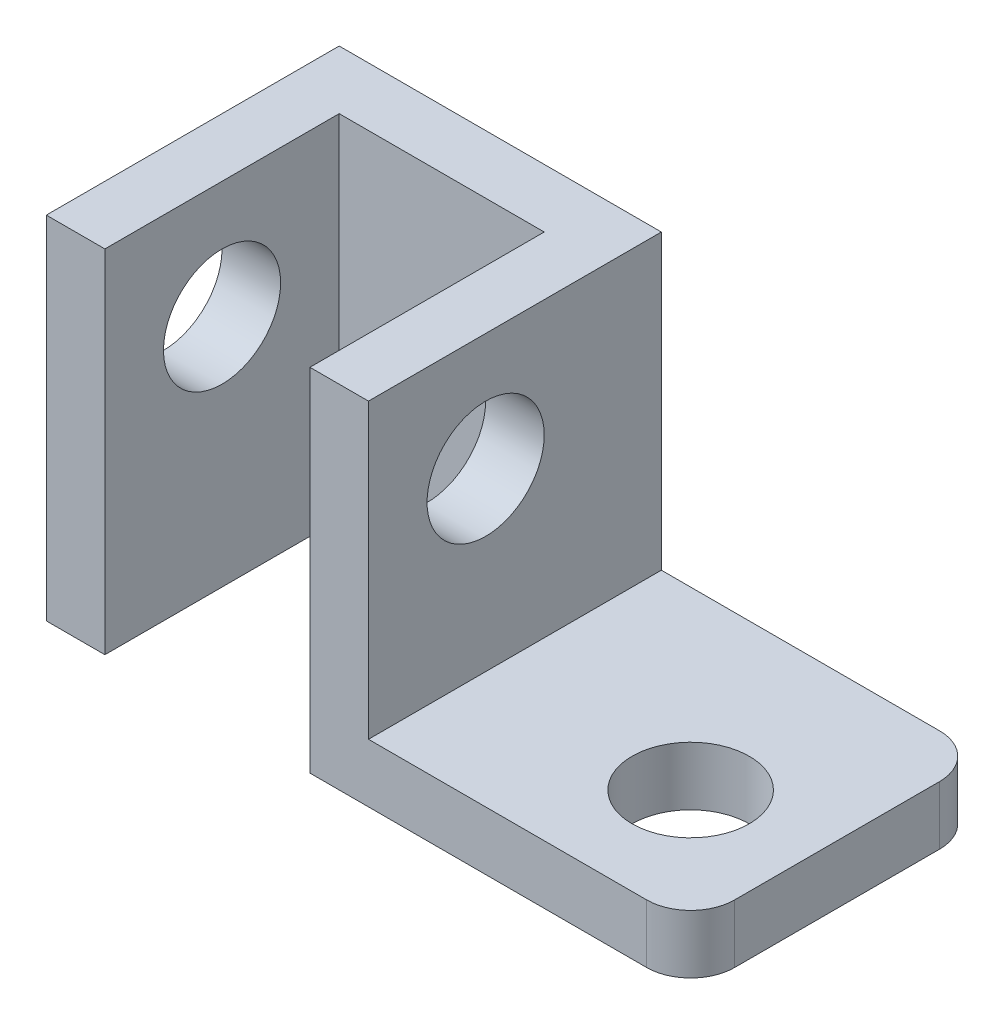
ISO-10303-21;
HEADER;
FILE_DESCRIPTION(('STEP AP214'),'2;1');
FILE_NAME('part.step','',(''),(''),'','','');
FILE_SCHEMA(('AUTOMOTIVE_DESIGN { 1 0 10303 214 1 1 1 1 }'));
ENDSEC;
DATA;
#1=APPLICATION_CONTEXT('core data for automotive mechanical design processes');
#2=APPLICATION_PROTOCOL_DEFINITION('international standard','automotive_design',2000,#1);
#3=PRODUCT_CONTEXT('',#1,'mechanical');
#4=PRODUCT('Part','Part','',(#3));
#5=PRODUCT_RELATED_PRODUCT_CATEGORY('part','',(#4));
#6=PRODUCT_DEFINITION_FORMATION('','',#4);
#7=PRODUCT_DEFINITION_CONTEXT('part definition',#1,'design');
#8=PRODUCT_DEFINITION('design','',#6,#7);
#9=PRODUCT_DEFINITION_SHAPE('','',#8);
#10=(LENGTH_UNIT() NAMED_UNIT(*) SI_UNIT(.MILLI.,.METRE.));
#11=(NAMED_UNIT(*) PLANE_ANGLE_UNIT() SI_UNIT($,.RADIAN.));
#12=(NAMED_UNIT(*) SI_UNIT($,.STERADIAN.) SOLID_ANGLE_UNIT());
#13=UNCERTAINTY_MEASURE_WITH_UNIT(LENGTH_MEASURE(1.E-05),#10,'distance_accuracy_value','');
#14=(GEOMETRIC_REPRESENTATION_CONTEXT(3) GLOBAL_UNCERTAINTY_ASSIGNED_CONTEXT((#13)) GLOBAL_UNIT_ASSIGNED_CONTEXT((#10,
#11,#12)) REPRESENTATION_CONTEXT('',''));
#15=CARTESIAN_POINT('',(0.,0.,0.));
#16=DIRECTION('',(0.,0.,1.));
#17=DIRECTION('',(1.,0.,0.));
#18=AXIS2_PLACEMENT_3D('',#15,#16,#17);
#19=CARTESIAN_POINT('',(1.44755331656576E-13,508.,1016.));
#20=DIRECTION('',(0.,0.,-1.));
#21=DIRECTION('',(-1.,0.,0.));
#22=AXIS2_PLACEMENT_3D('',#19,#20,#21);
#23=PLANE('',#22);
#24=DIRECTION('',(1.,0.,0.));
#25=VECTOR('',#24,1.);
#26=CARTESIAN_POINT('',(1.44755331656576E-13,0.,1016.));
#27=LINE('',#26,#25);
#28=CARTESIAN_POINT('',(-508.,0.,1016.));
#29=VERTEX_POINT('',#28);
#30=CARTESIAN_POINT('',(2413.,0.,1016.));
#31=VERTEX_POINT('',#30);
#32=EDGE_CURVE('E126',#29,#31,#27,.T.);
#33=ORIENTED_EDGE('',*,*,#32,.T.);
#34=DIRECTION('',(0.,-1.,0.));
#35=VECTOR('',#34,1.);
#36=CARTESIAN_POINT('',(2413.,508.,1016.));
#37=LINE('',#36,#35);
#38=CARTESIAN_POINT('',(2413.,508.,1016.));
#39=VERTEX_POINT('',#38);
#40=EDGE_CURVE('E11',#39,#31,#37,.T.);
#41=ORIENTED_EDGE('',*,*,#40,.F.);
#42=DIRECTION('',(1.,0.,0.));
#43=VECTOR('',#42,1.);
#44=CARTESIAN_POINT('',(1.44755331656576E-13,508.,1016.));
#45=LINE('',#44,#43);
#46=CARTESIAN_POINT('',(1.44755331656576E-13,508.,1016.));
#47=VERTEX_POINT('',#46);
#48=EDGE_CURVE('E142',#47,#39,#45,.T.);
#49=ORIENTED_EDGE('',*,*,#48,.F.);
#50=DIRECTION('',(0.,-1.,0.));
#51=VECTOR('',#50,1.);
#52=CARTESIAN_POINT('',(3.48738661677066E-13,3048.,1016.));
#53=LINE('',#52,#51);
#54=CARTESIAN_POINT('',(3.48738661677066E-13,3048.,1016.));
#55=VERTEX_POINT('',#54);
#56=EDGE_CURVE('E60',#55,#47,#53,.T.);
#57=ORIENTED_EDGE('',*,*,#56,.F.);
#58=DIRECTION('',(1.,0.,0.));
#59=VECTOR('',#58,1.);
#60=CARTESIAN_POINT('',(-508.,3048.,1016.));
#61=LINE('',#60,#59);
#62=CARTESIAN_POINT('',(-508.,3048.,1016.));
#63=VERTEX_POINT('',#62);
#64=EDGE_CURVE('E312',#63,#55,#61,.T.);
#65=ORIENTED_EDGE('',*,*,#64,.F.);
#66=DIRECTION('',(0.,-1.,0.));
#67=VECTOR('',#66,1.);
#68=CARTESIAN_POINT('',(-508.,3048.,1016.));
#69=LINE('',#68,#67);
#70=EDGE_CURVE('E187',#63,#29,#69,.T.);
#71=ORIENTED_EDGE('',*,*,#70,.T.);
#72=EDGE_LOOP('',(#33,#41,#49,#57,#65,#71));
#73=FACE_BOUND('',#72,.T.);
#74=ADVANCED_FACE('F43',(#73),#23,.F.);
#75=CARTESIAN_POINT('',(2413.,508.,635.));
#76=DIRECTION('',(0.,-1.,0.));
#77=DIRECTION('',(0.,0.,-1.));
#78=AXIS2_PLACEMENT_3D('',#75,#76,#77);
#79=CYLINDRICAL_SURFACE('',#78,381.);
#80=CARTESIAN_POINT('',(2413.,0.,635.));
#81=DIRECTION('',(0.,1.,0.));
#82=DIRECTION('',(0.,0.,1.));
#83=AXIS2_PLACEMENT_3D('',#80,#81,#82);
#84=CIRCLE('',#83,381.);
#85=CARTESIAN_POINT('',(2794.,0.,635.));
#86=VERTEX_POINT('',#85);
#87=EDGE_CURVE('E130',#31,#86,#84,.T.);
#88=ORIENTED_EDGE('',*,*,#87,.T.);
#89=DIRECTION('',(0.,-1.,0.));
#90=VECTOR('',#89,1.);
#91=CARTESIAN_POINT('',(2794.,508.,635.));
#92=LINE('',#91,#90);
#93=CARTESIAN_POINT('',(2794.,508.,635.));
#94=VERTEX_POINT('',#93);
#95=EDGE_CURVE('E52',#94,#86,#92,.T.);
#96=ORIENTED_EDGE('',*,*,#95,.F.);
#97=CARTESIAN_POINT('',(2413.,508.,635.));
#98=DIRECTION('',(0.,1.,0.));
#99=DIRECTION('',(0.,0.,1.));
#100=AXIS2_PLACEMENT_3D('',#97,#98,#99);
#101=CIRCLE('',#100,381.);
#102=EDGE_CURVE('E94',#39,#94,#101,.T.);
#103=ORIENTED_EDGE('',*,*,#102,.F.);
#104=ORIENTED_EDGE('',*,*,#40,.T.);
#105=EDGE_LOOP('',(#88,#96,#103,#104));
#106=FACE_BOUND('',#105,.T.);
#107=ADVANCED_FACE('F219',(#106),#79,.T.);
#108=CARTESIAN_POINT('',(2794.,508.,-1143.));
#109=DIRECTION('',(-1.,0.,0.));
#110=DIRECTION('',(0.,0.,1.));
#111=AXIS2_PLACEMENT_3D('',#108,#109,#110);
#112=PLANE('',#111);
#113=DIRECTION('',(0.,0.,-1.));
#114=VECTOR('',#113,1.);
#115=CARTESIAN_POINT('',(2794.,0.,-1143.));
#116=LINE('',#115,#114);
#117=CARTESIAN_POINT('',(2794.,0.,-1143.));
#118=VERTEX_POINT('',#117);
#119=EDGE_CURVE('E79',#86,#118,#116,.T.);
#120=ORIENTED_EDGE('',*,*,#119,.T.);
#121=DIRECTION('',(0.,-1.,0.));
#122=VECTOR('',#121,1.);
#123=CARTESIAN_POINT('',(2794.,508.,-1143.));
#124=LINE('',#123,#122);
#125=CARTESIAN_POINT('',(2794.,508.,-1143.));
#126=VERTEX_POINT('',#125);
#127=EDGE_CURVE('E109',#126,#118,#124,.T.);
#128=ORIENTED_EDGE('',*,*,#127,.F.);
#129=DIRECTION('',(0.,0.,-1.));
#130=VECTOR('',#129,1.);
#131=CARTESIAN_POINT('',(2794.,508.,-1143.));
#132=LINE('',#131,#130);
#133=EDGE_CURVE('E102',#94,#126,#132,.T.);
#134=ORIENTED_EDGE('',*,*,#133,.F.);
#135=ORIENTED_EDGE('',*,*,#95,.T.);
#136=EDGE_LOOP('',(#120,#128,#134,#135));
#137=FACE_BOUND('',#136,.T.);
#138=ADVANCED_FACE('F110',(#137),#112,.F.);
#139=CARTESIAN_POINT('',(2413.,508.,-1143.));
#140=DIRECTION('',(0.,-1.,0.));
#141=DIRECTION('',(0.,0.,-1.));
#142=AXIS2_PLACEMENT_3D('',#139,#140,#141);
#143=CYLINDRICAL_SURFACE('',#142,381.);
#144=CARTESIAN_POINT('',(2413.,0.,-1143.));
#145=DIRECTION('',(0.,1.,0.));
#146=DIRECTION('',(0.,0.,-1.));
#147=AXIS2_PLACEMENT_3D('',#144,#145,#146);
#148=CIRCLE('',#147,381.);
#149=CARTESIAN_POINT('',(2413.,0.,-1524.));
#150=VERTEX_POINT('',#149);
#151=EDGE_CURVE('E86',#118,#150,#148,.T.);
#152=ORIENTED_EDGE('',*,*,#151,.T.);
#153=DIRECTION('',(0.,-1.,0.));
#154=VECTOR('',#153,1.);
#155=CARTESIAN_POINT('',(2413.,508.,-1524.));
#156=LINE('',#155,#154);
#157=CARTESIAN_POINT('',(2413.,508.,-1524.));
#158=VERTEX_POINT('',#157);
#159=EDGE_CURVE('E112',#158,#150,#156,.T.);
#160=ORIENTED_EDGE('',*,*,#159,.F.);
#161=CARTESIAN_POINT('',(2413.,508.,-1143.));
#162=DIRECTION('',(0.,1.,0.));
#163=DIRECTION('',(0.,0.,-1.));
#164=AXIS2_PLACEMENT_3D('',#161,#162,#163);
#165=CIRCLE('',#164,381.);
#166=EDGE_CURVE('E106',#126,#158,#165,.T.);
#167=ORIENTED_EDGE('',*,*,#166,.F.);
#168=ORIENTED_EDGE('',*,*,#127,.T.);
#169=EDGE_LOOP('',(#152,#160,#167,#168));
#170=FACE_BOUND('',#169,.T.);
#171=ADVANCED_FACE('F114',(#170),#143,.T.);
#172=CARTESIAN_POINT('',(-1.66304955326852E-13,508.,-1524.));
#173=DIRECTION('',(0.,0.,1.));
#174=DIRECTION('',(1.,0.,0.));
#175=AXIS2_PLACEMENT_3D('',#172,#173,#174);
#176=PLANE('',#175);
#177=DIRECTION('',(-1.,0.,0.));
#178=VECTOR('',#177,1.);
#179=CARTESIAN_POINT('',(-1.66304955326852E-13,0.,-1524.));
#180=LINE('',#179,#178);
#181=CARTESIAN_POINT('',(-2794.,0.,-1524.));
#182=VERTEX_POINT('',#181);
#183=EDGE_CURVE('E138',#150,#182,#180,.T.);
#184=ORIENTED_EDGE('',*,*,#183,.T.);
#185=DIRECTION('',(0.,-1.,0.));
#186=VECTOR('',#185,1.);
#187=CARTESIAN_POINT('',(-2794.,3048.,-1524.));
#188=LINE('',#187,#186);
#189=CARTESIAN_POINT('',(-2794.,3048.,-1524.));
#190=VERTEX_POINT('',#189);
#191=EDGE_CURVE('E160',#190,#182,#188,.T.);
#192=ORIENTED_EDGE('',*,*,#191,.F.);
#193=DIRECTION('',(-1.,0.,0.));
#194=VECTOR('',#193,1.);
#195=CARTESIAN_POINT('',(-2794.,3048.,-1524.));
#196=LINE('',#195,#194);
#197=CARTESIAN_POINT('',(0.,3048.,-1524.));
#198=VERTEX_POINT('',#197);
#199=EDGE_CURVE('E172',#198,#190,#196,.T.);
#200=ORIENTED_EDGE('',*,*,#199,.F.);
#201=DIRECTION('',(0.,-1.,0.));
#202=VECTOR('',#201,1.);
#203=CARTESIAN_POINT('',(0.,3048.,-1524.));
#204=LINE('',#203,#202);
#205=CARTESIAN_POINT('',(0.,508.,-1524.));
#206=VERTEX_POINT('',#205);
#207=EDGE_CURVE('E171',#198,#206,#204,.T.);
#208=ORIENTED_EDGE('',*,*,#207,.T.);
#209=DIRECTION('',(-1.,0.,0.));
#210=VECTOR('',#209,1.);
#211=CARTESIAN_POINT('',(-1.66304955326852E-13,508.,-1524.));
#212=LINE('',#211,#210);
#213=EDGE_CURVE('E117',#158,#206,#212,.T.);
#214=ORIENTED_EDGE('',*,*,#213,.F.);
#215=ORIENTED_EDGE('',*,*,#159,.T.);
#216=EDGE_LOOP('',(#184,#192,#200,#208,#214,#215));
#217=FACE_BOUND('',#216,.T.);
#218=ADVANCED_FACE('F157',(#217),#176,.F.);
#219=CARTESIAN_POINT('',(2413.,508.,635.));
#220=DIRECTION('',(0.,1.,0.));
#221=DIRECTION('',(0.,0.,1.));
#222=AXIS2_PLACEMENT_3D('',#219,#220,#221);
#223=PLANE('',#222);
#224=CARTESIAN_POINT('',(1778.,508.,0.));
#225=DIRECTION('',(0.,1.,0.));
#226=DIRECTION('',(0.,0.,1.));
#227=AXIS2_PLACEMENT_3D('',#224,#225,#226);
#228=CIRCLE('',#227,508.000000000001);
#229=CARTESIAN_POINT('',(1778.,508.,508.000000000001));
#230=VERTEX_POINT('',#229);
#231=EDGE_CURVE('E131',#230,#230,#228,.T.);
#232=ORIENTED_EDGE('',*,*,#231,.F.);
#233=EDGE_LOOP('',(#232));
#234=FACE_BOUND('',#233,.T.);
#235=ORIENTED_EDGE('',*,*,#48,.T.);
#236=ORIENTED_EDGE('',*,*,#102,.T.);
#237=ORIENTED_EDGE('',*,*,#133,.T.);
#238=ORIENTED_EDGE('',*,*,#166,.T.);
#239=ORIENTED_EDGE('',*,*,#213,.T.);
#240=DIRECTION('',(0.,0.,1.));
#241=VECTOR('',#240,1.);
#242=CARTESIAN_POINT('',(-1.66304955326852E-13,508.,-1524.));
#243=LINE('',#242,#241);
#244=EDGE_CURVE('E120',#206,#47,#243,.T.);
#245=ORIENTED_EDGE('',*,*,#244,.T.);
#246=EDGE_LOOP('',(#235,#236,#237,#238,#239,#245));
#247=FACE_BOUND('',#246,.T.);
#248=ADVANCED_FACE('F103',(#234,#247),#223,.T.);
#249=CARTESIAN_POINT('',(2413.,0.,635.));
#250=DIRECTION('',(0.,1.,0.));
#251=DIRECTION('',(0.,0.,1.));
#252=AXIS2_PLACEMENT_3D('',#249,#250,#251);
#253=PLANE('',#252);
#254=CARTESIAN_POINT('',(1778.,0.,0.));
#255=DIRECTION('',(0.,1.,0.));
#256=DIRECTION('',(0.,0.,1.));
#257=AXIS2_PLACEMENT_3D('',#254,#255,#256);
#258=CIRCLE('',#257,508.000000000001);
#259=CARTESIAN_POINT('',(1778.,0.,508.000000000001));
#260=VERTEX_POINT('',#259);
#261=EDGE_CURVE('E207',#260,#260,#258,.T.);
#262=ORIENTED_EDGE('',*,*,#261,.T.);
#263=EDGE_LOOP('',(#262));
#264=FACE_BOUND('',#263,.T.);
#265=ORIENTED_EDGE('',*,*,#32,.F.);
#266=DIRECTION('',(0.,0.,1.));
#267=VECTOR('',#266,1.);
#268=CARTESIAN_POINT('',(-508.,0.,-1016.));
#269=LINE('',#268,#267);
#270=CARTESIAN_POINT('',(-508.,0.,-1016.));
#271=VERTEX_POINT('',#270);
#272=EDGE_CURVE('E182',#271,#29,#269,.T.);
#273=ORIENTED_EDGE('',*,*,#272,.F.);
#274=DIRECTION('',(1.,0.,0.));
#275=VECTOR('',#274,1.);
#276=CARTESIAN_POINT('',(-2286.,0.,-1016.));
#277=LINE('',#276,#275);
#278=CARTESIAN_POINT('',(-2286.,0.,-1016.));
#279=VERTEX_POINT('',#278);
#280=EDGE_CURVE('E325',#279,#271,#277,.T.);
#281=ORIENTED_EDGE('',*,*,#280,.F.);
#282=DIRECTION('',(0.,0.,-1.));
#283=VECTOR('',#282,1.);
#284=CARTESIAN_POINT('',(-2286.,0.,-1016.));
#285=LINE('',#284,#283);
#286=CARTESIAN_POINT('',(-2286.,0.,1016.));
#287=VERTEX_POINT('',#286);
#288=EDGE_CURVE('E322',#287,#279,#285,.T.);
#289=ORIENTED_EDGE('',*,*,#288,.F.);
#290=DIRECTION('',(1.,0.,0.));
#291=VECTOR('',#290,1.);
#292=CARTESIAN_POINT('',(-2794.,0.,1016.));
#293=LINE('',#292,#291);
#294=CARTESIAN_POINT('',(-2794.,0.,1016.));
#295=VERTEX_POINT('',#294);
#296=EDGE_CURVE('E288',#295,#287,#293,.T.);
#297=ORIENTED_EDGE('',*,*,#296,.F.);
#298=DIRECTION('',(0.,0.,1.));
#299=VECTOR('',#298,1.);
#300=CARTESIAN_POINT('',(-2794.,0.,-1524.));
#301=LINE('',#300,#299);
#302=EDGE_CURVE('E153',#182,#295,#301,.T.);
#303=ORIENTED_EDGE('',*,*,#302,.F.);
#304=ORIENTED_EDGE('',*,*,#183,.F.);
#305=ORIENTED_EDGE('',*,*,#151,.F.);
#306=ORIENTED_EDGE('',*,*,#119,.F.);
#307=ORIENTED_EDGE('',*,*,#87,.F.);
#308=EDGE_LOOP('',(#265,#273,#281,#289,#297,#303,#304,#305,#306,#307));
#309=FACE_BOUND('',#308,.T.);
#310=ADVANCED_FACE('F147',(#264,#309),#253,.F.);
#311=CARTESIAN_POINT('',(1778.,508.,0.));
#312=DIRECTION('',(0.,-1.,0.));
#313=DIRECTION('',(0.,0.,-1.));
#314=AXIS2_PLACEMENT_3D('',#311,#312,#313);
#315=CYLINDRICAL_SURFACE('',#314,508.000000000001);
#316=ORIENTED_EDGE('',*,*,#231,.T.);
#317=EDGE_LOOP('',(#316));
#318=FACE_BOUND('',#317,.T.);
#319=ORIENTED_EDGE('',*,*,#261,.F.);
#320=EDGE_LOOP('',(#319));
#321=FACE_BOUND('',#320,.T.);
#322=ADVANCED_FACE('F233',(#318,#321),#315,.F.);
#323=CARTESIAN_POINT('',(-2794.,3048.,-1524.));
#324=DIRECTION('',(1.,0.,0.));
#325=DIRECTION('',(0.,0.,-1.));
#326=AXIS2_PLACEMENT_3D('',#323,#324,#325);
#327=PLANE('',#326);
#328=CARTESIAN_POINT('',(-2794.,2032.,0.));
#329=DIRECTION('',(1.,0.,0.));
#330=DIRECTION('',(0.,0.,-1.));
#331=AXIS2_PLACEMENT_3D('',#328,#329,#330);
#332=CIRCLE('',#331,508.);
#333=CARTESIAN_POINT('',(-2794.,2032.,-508.));
#334=VERTEX_POINT('',#333);
#335=EDGE_CURVE('E279',#334,#334,#332,.T.);
#336=ORIENTED_EDGE('',*,*,#335,.T.);
#337=EDGE_LOOP('',(#336));
#338=FACE_BOUND('',#337,.T.);
#339=ORIENTED_EDGE('',*,*,#302,.T.);
#340=DIRECTION('',(0.,-1.,0.));
#341=VECTOR('',#340,1.);
#342=CARTESIAN_POINT('',(-2794.,3048.,1016.));
#343=LINE('',#342,#341);
#344=CARTESIAN_POINT('',(-2794.,3048.,1016.));
#345=VERTEX_POINT('',#344);
#346=EDGE_CURVE('E203',#345,#295,#343,.T.);
#347=ORIENTED_EDGE('',*,*,#346,.F.);
#348=DIRECTION('',(0.,0.,1.));
#349=VECTOR('',#348,1.);
#350=CARTESIAN_POINT('',(-2794.,3048.,-1524.));
#351=LINE('',#350,#349);
#352=EDGE_CURVE('E169',#190,#345,#351,.T.);
#353=ORIENTED_EDGE('',*,*,#352,.F.);
#354=ORIENTED_EDGE('',*,*,#191,.T.);
#355=EDGE_LOOP('',(#339,#347,#353,#354));
#356=FACE_BOUND('',#355,.T.);
#357=ADVANCED_FACE('F165',(#338,#356),#327,.F.);
#358=CARTESIAN_POINT('',(-2794.,3048.,1016.));
#359=DIRECTION('',(0.,0.,-1.));
#360=DIRECTION('',(-1.,0.,0.));
#361=AXIS2_PLACEMENT_3D('',#358,#359,#360);
#362=PLANE('',#361);
#363=ORIENTED_EDGE('',*,*,#296,.T.);
#364=DIRECTION('',(0.,-1.,0.));
#365=VECTOR('',#364,1.);
#366=CARTESIAN_POINT('',(-2286.,3048.,1016.));
#367=LINE('',#366,#365);
#368=CARTESIAN_POINT('',(-2286.,3048.,1016.));
#369=VERTEX_POINT('',#368);
#370=EDGE_CURVE('E199',#369,#287,#367,.T.);
#371=ORIENTED_EDGE('',*,*,#370,.F.);
#372=DIRECTION('',(1.,0.,0.));
#373=VECTOR('',#372,1.);
#374=CARTESIAN_POINT('',(-2794.,3048.,1016.));
#375=LINE('',#374,#373);
#376=EDGE_CURVE('E296',#345,#369,#375,.T.);
#377=ORIENTED_EDGE('',*,*,#376,.F.);
#378=ORIENTED_EDGE('',*,*,#346,.T.);
#379=EDGE_LOOP('',(#363,#371,#377,#378));
#380=FACE_BOUND('',#379,.T.);
#381=ADVANCED_FACE('F243',(#380),#362,.F.);
#382=CARTESIAN_POINT('',(-2286.,3048.,-1016.));
#383=DIRECTION('',(-1.,0.,0.));
#384=DIRECTION('',(0.,0.,1.));
#385=AXIS2_PLACEMENT_3D('',#382,#383,#384);
#386=PLANE('',#385);
#387=CARTESIAN_POINT('',(-2286.,2032.,0.));
#388=DIRECTION('',(-1.,0.,0.));
#389=DIRECTION('',(0.,0.,1.));
#390=AXIS2_PLACEMENT_3D('',#387,#388,#389);
#391=CIRCLE('',#390,508.);
#392=CARTESIAN_POINT('',(-2286.,2032.,508.));
#393=VERTEX_POINT('',#392);
#394=EDGE_CURVE('E282',#393,#393,#391,.T.);
#395=ORIENTED_EDGE('',*,*,#394,.T.);
#396=EDGE_LOOP('',(#395));
#397=FACE_BOUND('',#396,.T.);
#398=ORIENTED_EDGE('',*,*,#288,.T.);
#399=DIRECTION('',(0.,-1.,0.));
#400=VECTOR('',#399,1.);
#401=CARTESIAN_POINT('',(-2286.,3048.,-1016.));
#402=LINE('',#401,#400);
#403=CARTESIAN_POINT('',(-2286.,3048.,-1016.));
#404=VERTEX_POINT('',#403);
#405=EDGE_CURVE('E195',#404,#279,#402,.T.);
#406=ORIENTED_EDGE('',*,*,#405,.F.);
#407=DIRECTION('',(0.,0.,-1.));
#408=VECTOR('',#407,1.);
#409=CARTESIAN_POINT('',(-2286.,3048.,-1016.));
#410=LINE('',#409,#408);
#411=EDGE_CURVE('E300',#369,#404,#410,.T.);
#412=ORIENTED_EDGE('',*,*,#411,.F.);
#413=ORIENTED_EDGE('',*,*,#370,.T.);
#414=EDGE_LOOP('',(#398,#406,#412,#413));
#415=FACE_BOUND('',#414,.T.);
#416=ADVANCED_FACE('F247',(#397,#415),#386,.F.);
#417=CARTESIAN_POINT('',(-2286.,3048.,-1016.));
#418=DIRECTION('',(0.,0.,-1.));
#419=DIRECTION('',(-1.,0.,0.));
#420=AXIS2_PLACEMENT_3D('',#417,#418,#419);
#421=PLANE('',#420);
#422=ORIENTED_EDGE('',*,*,#280,.T.);
#423=DIRECTION('',(0.,-1.,0.));
#424=VECTOR('',#423,1.);
#425=CARTESIAN_POINT('',(-508.,3048.,-1016.));
#426=LINE('',#425,#424);
#427=CARTESIAN_POINT('',(-508.,3048.,-1016.));
#428=VERTEX_POINT('',#427);
#429=EDGE_CURVE('E191',#428,#271,#426,.T.);
#430=ORIENTED_EDGE('',*,*,#429,.F.);
#431=DIRECTION('',(1.,0.,0.));
#432=VECTOR('',#431,1.);
#433=CARTESIAN_POINT('',(-2286.,3048.,-1016.));
#434=LINE('',#433,#432);
#435=EDGE_CURVE('E304',#404,#428,#434,.T.);
#436=ORIENTED_EDGE('',*,*,#435,.F.);
#437=ORIENTED_EDGE('',*,*,#405,.T.);
#438=EDGE_LOOP('',(#422,#430,#436,#437));
#439=FACE_BOUND('',#438,.T.);
#440=ADVANCED_FACE('F251',(#439),#421,.F.);
#441=CARTESIAN_POINT('',(-508.,3048.,-1016.));
#442=DIRECTION('',(1.,0.,0.));
#443=DIRECTION('',(0.,0.,-1.));
#444=AXIS2_PLACEMENT_3D('',#441,#442,#443);
#445=PLANE('',#444);
#446=CARTESIAN_POINT('',(-508.,2032.,0.));
#447=DIRECTION('',(1.,0.,0.));
#448=DIRECTION('',(0.,0.,-1.));
#449=AXIS2_PLACEMENT_3D('',#446,#447,#448);
#450=CIRCLE('',#449,508.);
#451=CARTESIAN_POINT('',(-508.,2032.,-508.));
#452=VERTEX_POINT('',#451);
#453=EDGE_CURVE('E284',#452,#452,#450,.T.);
#454=ORIENTED_EDGE('',*,*,#453,.T.);
#455=EDGE_LOOP('',(#454));
#456=FACE_BOUND('',#455,.T.);
#457=ORIENTED_EDGE('',*,*,#272,.T.);
#458=ORIENTED_EDGE('',*,*,#70,.F.);
#459=DIRECTION('',(0.,0.,1.));
#460=VECTOR('',#459,1.);
#461=CARTESIAN_POINT('',(-508.,3048.,-1016.));
#462=LINE('',#461,#460);
#463=EDGE_CURVE('E308',#428,#63,#462,.T.);
#464=ORIENTED_EDGE('',*,*,#463,.F.);
#465=ORIENTED_EDGE('',*,*,#429,.T.);
#466=EDGE_LOOP('',(#457,#458,#464,#465));
#467=FACE_BOUND('',#466,.T.);
#468=ADVANCED_FACE('F255',(#456,#467),#445,.F.);
#469=CARTESIAN_POINT('',(0.,3048.,-1524.));
#470=DIRECTION('',(-1.,0.,0.));
#471=DIRECTION('',(0.,0.,1.));
#472=AXIS2_PLACEMENT_3D('',#469,#470,#471);
#473=PLANE('',#472);
#474=CARTESIAN_POINT('',(0.,2032.,0.));
#475=DIRECTION('',(1.,0.,0.));
#476=DIRECTION('',(0.,0.,-1.));
#477=AXIS2_PLACEMENT_3D('',#474,#475,#476);
#478=CIRCLE('',#477,508.);
#479=CARTESIAN_POINT('',(0.,2032.,-508.));
#480=VERTEX_POINT('',#479);
#481=EDGE_CURVE('E367',#480,#480,#478,.T.);
#482=ORIENTED_EDGE('',*,*,#481,.F.);
#483=EDGE_LOOP('',(#482));
#484=FACE_BOUND('',#483,.T.);
#485=ORIENTED_EDGE('',*,*,#244,.F.);
#486=ORIENTED_EDGE('',*,*,#207,.F.);
#487=DIRECTION('',(0.,0.,-1.));
#488=VECTOR('',#487,1.);
#489=CARTESIAN_POINT('',(0.,3048.,-1524.));
#490=LINE('',#489,#488);
#491=EDGE_CURVE('E179',#55,#198,#490,.T.);
#492=ORIENTED_EDGE('',*,*,#491,.F.);
#493=ORIENTED_EDGE('',*,*,#56,.T.);
#494=EDGE_LOOP('',(#485,#486,#492,#493));
#495=FACE_BOUND('',#494,.T.);
#496=ADVANCED_FACE('F259',(#484,#495),#473,.F.);
#497=CARTESIAN_POINT('',(0.,3048.,0.));
#498=DIRECTION('',(0.,1.,0.));
#499=DIRECTION('',(0.,0.,1.));
#500=AXIS2_PLACEMENT_3D('',#497,#498,#499);
#501=PLANE('',#500);
#502=ORIENTED_EDGE('',*,*,#352,.T.);
#503=ORIENTED_EDGE('',*,*,#376,.T.);
#504=ORIENTED_EDGE('',*,*,#411,.T.);
#505=ORIENTED_EDGE('',*,*,#435,.T.);
#506=ORIENTED_EDGE('',*,*,#463,.T.);
#507=ORIENTED_EDGE('',*,*,#64,.T.);
#508=ORIENTED_EDGE('',*,*,#491,.T.);
#509=ORIENTED_EDGE('',*,*,#199,.T.);
#510=EDGE_LOOP('',(#502,#503,#504,#505,#506,#507,#508,#509));
#511=FACE_BOUND('',#510,.T.);
#512=ADVANCED_FACE('F263',(#511),#501,.T.);
#513=CARTESIAN_POINT('',(-2794.,2032.,0.));
#514=DIRECTION('',(1.,0.,0.));
#515=DIRECTION('',(0.,0.,-1.));
#516=AXIS2_PLACEMENT_3D('',#513,#514,#515);
#517=CYLINDRICAL_SURFACE('',#516,508.);
#518=ORIENTED_EDGE('',*,*,#481,.T.);
#519=EDGE_LOOP('',(#518));
#520=FACE_BOUND('',#519,.T.);
#521=ORIENTED_EDGE('',*,*,#453,.F.);
#522=EDGE_LOOP('',(#521));
#523=FACE_BOUND('',#522,.T.);
#524=ADVANCED_FACE('F267',(#520,#523),#517,.F.);
#525=ORIENTED_EDGE('',*,*,#335,.F.);
#526=EDGE_LOOP('',(#525));
#527=FACE_BOUND('',#526,.T.);
#528=ORIENTED_EDGE('',*,*,#394,.F.);
#529=EDGE_LOOP('',(#528));
#530=FACE_BOUND('',#529,.T.);
#531=ADVANCED_FACE('F269',(#527,#530),#517,.F.);
#532=CLOSED_SHELL('',(#74,#107,#138,#171,#218,#248,#310,#322,#357,#381,#416,#440,#468,#496,#512,
#524,#531));
#533=MANIFOLD_SOLID_BREP('B2',#532);
#534=ADVANCED_BREP_SHAPE_REPRESENTATION('',(#18,#533),#14);
#535=SHAPE_DEFINITION_REPRESENTATION(#9,#534);
ENDSEC;
END-ISO-10303-21;
